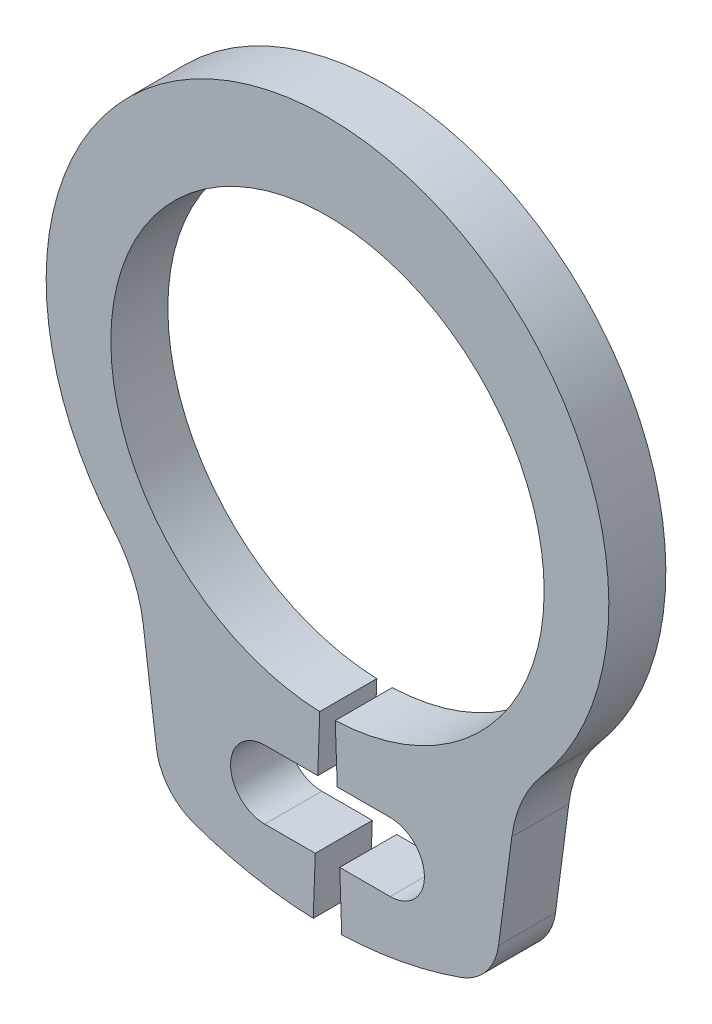
ISO-10303-21;
HEADER;
FILE_DESCRIPTION(('STEP AP214'),'2;1');
FILE_NAME('part.step','',(''),(''),'','','');
FILE_SCHEMA(('AUTOMOTIVE_DESIGN { 1 0 10303 214 1 1 1 1 }'));
ENDSEC;
DATA;
#1=APPLICATION_CONTEXT('core data for automotive mechanical design processes');
#2=APPLICATION_PROTOCOL_DEFINITION('international standard','automotive_design',2000,#1);
#3=PRODUCT_CONTEXT('',#1,'mechanical');
#4=PRODUCT('Part','Part','',(#3));
#5=PRODUCT_RELATED_PRODUCT_CATEGORY('part','',(#4));
#6=PRODUCT_DEFINITION_FORMATION('','',#4);
#7=PRODUCT_DEFINITION_CONTEXT('part definition',#1,'design');
#8=PRODUCT_DEFINITION('design','',#6,#7);
#9=PRODUCT_DEFINITION_SHAPE('','',#8);
#10=(LENGTH_UNIT() NAMED_UNIT(*) SI_UNIT(.MILLI.,.METRE.));
#11=(NAMED_UNIT(*) PLANE_ANGLE_UNIT() SI_UNIT($,.RADIAN.));
#12=(NAMED_UNIT(*) SI_UNIT($,.STERADIAN.) SOLID_ANGLE_UNIT());
#13=UNCERTAINTY_MEASURE_WITH_UNIT(LENGTH_MEASURE(1.E-05),#10,'distance_accuracy_value','');
#14=(GEOMETRIC_REPRESENTATION_CONTEXT(3) GLOBAL_UNCERTAINTY_ASSIGNED_CONTEXT((#13)) GLOBAL_UNIT_ASSIGNED_CONTEXT((#10,
#11,#12)) REPRESENTATION_CONTEXT('',''));
#15=CARTESIAN_POINT('',(0.,0.,0.));
#16=DIRECTION('',(0.,0.,1.));
#17=DIRECTION('',(1.,0.,0.));
#18=AXIS2_PLACEMENT_3D('',#15,#16,#17);
#19=CARTESIAN_POINT('',(-0.135714285714286,-3.79757575732902,-1.));
#20=DIRECTION('',(0.999362041402373,-0.0357142857142857,0.));
#21=DIRECTION('',(0.0357142857142857,0.999362041402373,0.));
#22=AXIS2_PLACEMENT_3D('',#19,#20,#21);
#23=PLANE('',#22);
#24=DIRECTION('',(0.,0.,1.));
#25=VECTOR('',#24,1.);
#26=CARTESIAN_POINT('',(-0.171140517497504,-4.78887743412299,-1.));
#27=LINE('',#26,#25);
#28=CARTESIAN_POINT('',(-0.171140517497504,-4.78887743412299,-1.));
#29=VERTEX_POINT('',#28);
#30=CARTESIAN_POINT('',(-0.171140517497504,-4.78887743412299,0.));
#31=VERTEX_POINT('',#30);
#32=EDGE_CURVE('E199',#29,#31,#27,.T.);
#33=ORIENTED_EDGE('',*,*,#32,.F.);
#34=DIRECTION('',(0.0357142857142857,0.999362041402373,0.));
#35=VECTOR('',#34,1.);
#36=CARTESIAN_POINT('',(-0.135714285714286,-3.79757575732902,-1.));
#37=LINE('',#36,#35);
#38=CARTESIAN_POINT('',(-0.135714285714286,-3.79757575732902,-1.));
#39=VERTEX_POINT('',#38);
#40=EDGE_CURVE('E281',#29,#39,#37,.T.);
#41=ORIENTED_EDGE('',*,*,#40,.T.);
#42=DIRECTION('',(0.,0.,1.));
#43=VECTOR('',#42,1.);
#44=CARTESIAN_POINT('',(-0.135714285714286,-3.79757575732902,-1.));
#45=LINE('',#44,#43);
#46=CARTESIAN_POINT('',(-0.135714285714286,-3.79757575732902,0.));
#47=VERTEX_POINT('',#46);
#48=EDGE_CURVE('E11',#39,#47,#45,.T.);
#49=ORIENTED_EDGE('',*,*,#48,.T.);
#50=DIRECTION('',(0.0357142857142857,0.999362041402373,0.));
#51=VECTOR('',#50,1.);
#52=CARTESIAN_POINT('',(-0.135714285714286,-3.79757575732902,0.));
#53=LINE('',#52,#51);
#54=EDGE_CURVE('E245',#31,#47,#53,.T.);
#55=ORIENTED_EDGE('',*,*,#54,.F.);
#56=EDGE_LOOP('',(#33,#41,#49,#55));
#57=FACE_BOUND('',#56,.T.);
#58=ADVANCED_FACE('F32',(#57),#23,.T.);
#59=CARTESIAN_POINT('',(0.135714285714286,-3.79757575732902,-1.));
#60=DIRECTION('',(-0.999362041402373,-0.0357142857142857,0.));
#61=DIRECTION('',(0.0357142857142857,-0.999362041402373,0.));
#62=AXIS2_PLACEMENT_3D('',#59,#60,#61);
#63=PLANE('',#62);
#64=DIRECTION('',(0.,0.,-1.));
#65=VECTOR('',#64,1.);
#66=CARTESIAN_POINT('',(0.171140517497504,-4.78887743412299,-1.));
#67=LINE('',#66,#65);
#68=CARTESIAN_POINT('',(0.171140517497504,-4.78887743412299,0.));
#69=VERTEX_POINT('',#68);
#70=CARTESIAN_POINT('',(0.171140517497504,-4.78887743412299,-1.));
#71=VERTEX_POINT('',#70);
#72=EDGE_CURVE('E203',#69,#71,#67,.T.);
#73=ORIENTED_EDGE('',*,*,#72,.F.);
#74=DIRECTION('',(0.0357142857142857,-0.999362041402373,0.));
#75=VECTOR('',#74,1.);
#76=CARTESIAN_POINT('',(0.135714285714286,-3.79757575732902,0.));
#77=LINE('',#76,#75);
#78=CARTESIAN_POINT('',(0.135714285714286,-3.79757575732902,0.));
#79=VERTEX_POINT('',#78);
#80=EDGE_CURVE('E216',#79,#69,#77,.T.);
#81=ORIENTED_EDGE('',*,*,#80,.F.);
#82=DIRECTION('',(0.,0.,1.));
#83=VECTOR('',#82,1.);
#84=CARTESIAN_POINT('',(0.135714285714286,-3.79757575732902,-1.));
#85=LINE('',#84,#83);
#86=CARTESIAN_POINT('',(0.135714285714286,-3.79757575732902,-1.));
#87=VERTEX_POINT('',#86);
#88=EDGE_CURVE('E36',#87,#79,#85,.T.);
#89=ORIENTED_EDGE('',*,*,#88,.F.);
#90=DIRECTION('',(0.0357142857142857,-0.999362041402373,0.));
#91=VECTOR('',#90,1.);
#92=CARTESIAN_POINT('',(0.135714285714286,-3.79757575732902,-1.));
#93=LINE('',#92,#91);
#94=EDGE_CURVE('E251',#87,#71,#93,.T.);
#95=ORIENTED_EDGE('',*,*,#94,.T.);
#96=EDGE_LOOP('',(#73,#81,#89,#95));
#97=FACE_BOUND('',#96,.T.);
#98=ADVANCED_FACE('F315',(#97),#63,.T.);
#99=CARTESIAN_POINT('',(0.,0.,-1.));
#100=DIRECTION('',(0.,0.,1.));
#101=DIRECTION('',(1.,0.,0.));
#102=AXIS2_PLACEMENT_3D('',#99,#100,#101);
#103=CYLINDRICAL_SURFACE('',#102,3.8);
#104=CARTESIAN_POINT('',(0.,0.,0.));
#105=DIRECTION('',(0.,0.,-1.));
#106=DIRECTION('',(1.,0.,0.));
#107=AXIS2_PLACEMENT_3D('',#104,#105,#106);
#108=CIRCLE('',#107,3.8);
#109=EDGE_CURVE('E212',#47,#79,#108,.T.);
#110=ORIENTED_EDGE('',*,*,#109,.F.);
#111=ORIENTED_EDGE('',*,*,#48,.F.);
#112=CARTESIAN_POINT('',(0.,0.,-1.));
#113=DIRECTION('',(0.,0.,-1.));
#114=DIRECTION('',(1.,0.,0.));
#115=AXIS2_PLACEMENT_3D('',#112,#113,#114);
#116=CIRCLE('',#115,3.8);
#117=EDGE_CURVE('E247',#39,#87,#116,.T.);
#118=ORIENTED_EDGE('',*,*,#117,.T.);
#119=ORIENTED_EDGE('',*,*,#88,.T.);
#120=EDGE_LOOP('',(#110,#111,#118,#119));
#121=FACE_BOUND('',#120,.T.);
#122=ADVANCED_FACE('F34',(#121),#103,.F.);
#123=DIRECTION('',(0.,0.,-1.));
#124=VECTOR('',#123,1.);
#125=CARTESIAN_POINT('',(-0.214025018891016,-5.98887743412299,-1.));
#126=LINE('',#125,#124);
#127=CARTESIAN_POINT('',(-0.214025018891016,-5.98887743412299,0.));
#128=VERTEX_POINT('',#127);
#129=CARTESIAN_POINT('',(-0.214025018891016,-5.98887743412299,-1.));
#130=VERTEX_POINT('',#129);
#131=EDGE_CURVE('E337',#128,#130,#126,.T.);
#132=ORIENTED_EDGE('',*,*,#131,.F.);
#133=CARTESIAN_POINT('',(-0.25,-6.99553428981661,0.));
#134=VERTEX_POINT('',#133);
#135=EDGE_CURVE('E193',#134,#128,#53,.T.);
#136=ORIENTED_EDGE('',*,*,#135,.F.);
#137=DIRECTION('',(0.,0.,1.));
#138=VECTOR('',#137,1.);
#139=CARTESIAN_POINT('',(-0.25,-6.99553428981661,-1.));
#140=LINE('',#139,#138);
#141=CARTESIAN_POINT('',(-0.25,-6.99553428981661,-1.));
#142=VERTEX_POINT('',#141);
#143=EDGE_CURVE('E41',#142,#134,#140,.T.);
#144=ORIENTED_EDGE('',*,*,#143,.F.);
#145=EDGE_CURVE('E282',#142,#130,#37,.T.);
#146=ORIENTED_EDGE('',*,*,#145,.T.);
#147=EDGE_LOOP('',(#132,#136,#144,#146));
#148=FACE_BOUND('',#147,.T.);
#149=ADVANCED_FACE('F346',(#148),#23,.T.);
#150=CARTESIAN_POINT('',(0.,0.,-1.));
#151=DIRECTION('',(0.,0.,1.));
#152=DIRECTION('',(1.,0.,0.));
#153=AXIS2_PLACEMENT_3D('',#150,#151,#152);
#154=CYLINDRICAL_SURFACE('',#153,7.);
#155=CARTESIAN_POINT('',(0.,0.,0.));
#156=DIRECTION('',(0.,0.,1.));
#157=DIRECTION('',(1.,0.,0.));
#158=AXIS2_PLACEMENT_3D('',#155,#156,#157);
#159=CIRCLE('',#158,7.);
#160=CARTESIAN_POINT('',(-2.34274629481053,-6.59632775096504,0.));
#161=VERTEX_POINT('',#160);
#162=EDGE_CURVE('E243',#161,#134,#159,.T.);
#163=ORIENTED_EDGE('',*,*,#162,.F.);
#164=DIRECTION('',(0.,0.,1.));
#165=VECTOR('',#164,1.);
#166=CARTESIAN_POINT('',(-2.34274629481053,-6.59632775096504,-1.));
#167=LINE('',#166,#165);
#168=CARTESIAN_POINT('',(-2.34274629481053,-6.59632775096504,-1.));
#169=VERTEX_POINT('',#168);
#170=EDGE_CURVE('E286',#169,#161,#167,.T.);
#171=ORIENTED_EDGE('',*,*,#170,.F.);
#172=CARTESIAN_POINT('',(0.,0.,-1.));
#173=DIRECTION('',(0.,0.,1.));
#174=DIRECTION('',(1.,0.,0.));
#175=AXIS2_PLACEMENT_3D('',#172,#173,#174);
#176=CIRCLE('',#175,7.);
#177=EDGE_CURVE('E278',#169,#142,#176,.T.);
#178=ORIENTED_EDGE('',*,*,#177,.T.);
#179=ORIENTED_EDGE('',*,*,#143,.T.);
#180=EDGE_LOOP('',(#163,#171,#178,#179));
#181=FACE_BOUND('',#180,.T.);
#182=ADVANCED_FACE('F349',(#181),#154,.T.);
#183=CARTESIAN_POINT('',(-2.00806825269474,-5.65399521511289,-1.));
#184=DIRECTION('',(0.,0.,1.));
#185=DIRECTION('',(1.,0.,0.));
#186=AXIS2_PLACEMENT_3D('',#183,#184,#185);
#187=CYLINDRICAL_SURFACE('',#186,1.);
#188=CARTESIAN_POINT('',(-2.00806825269474,-5.65399521511289,0.));
#189=DIRECTION('',(0.,0.,1.));
#190=DIRECTION('',(1.,0.,0.));
#191=AXIS2_PLACEMENT_3D('',#188,#189,#190);
#192=CIRCLE('',#191,1.);
#193=CARTESIAN_POINT('',(-2.99951311406855,-5.78452140733294,0.));
#194=VERTEX_POINT('',#193);
#195=EDGE_CURVE('E240',#194,#161,#192,.T.);
#196=ORIENTED_EDGE('',*,*,#195,.F.);
#197=DIRECTION('',(0.,0.,1.));
#198=VECTOR('',#197,1.);
#199=CARTESIAN_POINT('',(-2.99951311406855,-5.78452140733294,-1.));
#200=LINE('',#199,#198);
#201=CARTESIAN_POINT('',(-2.99951311406855,-5.78452140733294,-1.));
#202=VERTEX_POINT('',#201);
#203=EDGE_CURVE('E288',#202,#194,#200,.T.);
#204=ORIENTED_EDGE('',*,*,#203,.F.);
#205=CARTESIAN_POINT('',(-2.00806825269474,-5.65399521511289,-1.));
#206=DIRECTION('',(0.,0.,1.));
#207=DIRECTION('',(1.,0.,0.));
#208=AXIS2_PLACEMENT_3D('',#205,#206,#207);
#209=CIRCLE('',#208,1.);
#210=EDGE_CURVE('E275',#202,#169,#209,.T.);
#211=ORIENTED_EDGE('',*,*,#210,.T.);
#212=ORIENTED_EDGE('',*,*,#170,.T.);
#213=EDGE_LOOP('',(#196,#204,#211,#212));
#214=FACE_BOUND('',#213,.T.);
#215=ADVANCED_FACE('F354',(#214),#187,.T.);
#216=CARTESIAN_POINT('',(-3.232103528292,-4.01782181191477,-1.));
#217=DIRECTION('',(-0.99144486137381,-0.130526192220053,0.));
#218=DIRECTION('',(0.130526192220053,-0.99144486137381,0.));
#219=AXIS2_PLACEMENT_3D('',#216,#217,#218);
#220=PLANE('',#219);
#221=DIRECTION('',(0.130526192220053,-0.99144486137381,0.));
#222=VECTOR('',#221,1.);
#223=CARTESIAN_POINT('',(-3.232103528292,-4.01782181191477,0.));
#224=LINE('',#223,#222);
#225=CARTESIAN_POINT('',(-3.232103528292,-4.01782181191477,0.));
#226=VERTEX_POINT('',#225);
#227=EDGE_CURVE('E237',#226,#194,#224,.T.);
#228=ORIENTED_EDGE('',*,*,#227,.F.);
#229=DIRECTION('',(0.,0.,1.));
#230=VECTOR('',#229,1.);
#231=CARTESIAN_POINT('',(-3.232103528292,-4.01782181191477,-1.));
#232=LINE('',#231,#230);
#233=CARTESIAN_POINT('',(-3.232103528292,-4.01782181191477,-1.));
#234=VERTEX_POINT('',#233);
#235=EDGE_CURVE('E290',#234,#226,#232,.T.);
#236=ORIENTED_EDGE('',*,*,#235,.F.);
#237=DIRECTION('',(0.130526192220053,-0.99144486137381,0.));
#238=VECTOR('',#237,1.);
#239=CARTESIAN_POINT('',(-3.232103528292,-4.01782181191477,-1.));
#240=LINE('',#239,#238);
#241=EDGE_CURVE('E272',#234,#202,#240,.T.);
#242=ORIENTED_EDGE('',*,*,#241,.T.);
#243=ORIENTED_EDGE('',*,*,#203,.T.);
#244=EDGE_LOOP('',(#228,#236,#242,#243));
#245=FACE_BOUND('',#244,.T.);
#246=ADVANCED_FACE('F357',(#245),#220,.T.);
#247=CARTESIAN_POINT('',(-5.50977445658009,-4.3176828783061,-1.));
#248=DIRECTION('',(0.,0.,1.));
#249=DIRECTION('',(1.,0.,0.));
#250=AXIS2_PLACEMENT_3D('',#247,#248,#249);
#251=CYLINDRICAL_SURFACE('',#250,2.29732486094285);
#252=CARTESIAN_POINT('',(-5.50977445658009,-4.3176828783061,0.));
#253=DIRECTION('',(0.,0.,-1.));
#254=DIRECTION('',(1.,0.,0.));
#255=AXIS2_PLACEMENT_3D('',#252,#253,#254);
#256=CIRCLE('',#255,2.29732486094285);
#257=CARTESIAN_POINT('',(-3.75939498804083,-2.82977386468252,0.));
#258=VERTEX_POINT('',#257);
#259=EDGE_CURVE('E234',#258,#226,#256,.T.);
#260=ORIENTED_EDGE('',*,*,#259,.F.);
#261=DIRECTION('',(0.,0.,1.));
#262=VECTOR('',#261,1.);
#263=CARTESIAN_POINT('',(-3.75939498804083,-2.82977386468252,-1.));
#264=LINE('',#263,#262);
#265=CARTESIAN_POINT('',(-3.75939498804083,-2.82977386468252,-1.));
#266=VERTEX_POINT('',#265);
#267=EDGE_CURVE('E292',#266,#258,#264,.T.);
#268=ORIENTED_EDGE('',*,*,#267,.F.);
#269=CARTESIAN_POINT('',(-5.50977445658009,-4.3176828783061,-1.));
#270=DIRECTION('',(0.,0.,-1.));
#271=DIRECTION('',(1.,0.,0.));
#272=AXIS2_PLACEMENT_3D('',#269,#270,#271);
#273=CIRCLE('',#272,2.29732486094285);
#274=EDGE_CURVE('E269',#266,#234,#273,.T.);
#275=ORIENTED_EDGE('',*,*,#274,.T.);
#276=ORIENTED_EDGE('',*,*,#235,.T.);
#277=EDGE_LOOP('',(#260,#268,#275,#276));
#278=FACE_BOUND('',#277,.T.);
#279=ADVANCED_FACE('F362',(#278),#251,.F.);
#280=CARTESIAN_POINT('',(0.,0.365897582003999,-1.));
#281=DIRECTION('',(0.,0.,1.));
#282=DIRECTION('',(1.,0.,0.));
#283=AXIS2_PLACEMENT_3D('',#280,#281,#282);
#284=CYLINDRICAL_SURFACE('',#283,4.934102417996);
#285=CARTESIAN_POINT('',(0.,0.365897582003999,0.));
#286=DIRECTION('',(0.,0.,1.));
#287=DIRECTION('',(1.,0.,0.));
#288=AXIS2_PLACEMENT_3D('',#285,#286,#287);
#289=CIRCLE('',#288,4.934102417996);
#290=CARTESIAN_POINT('',(3.75939498804082,-2.82977386468252,0.));
#291=VERTEX_POINT('',#290);
#292=EDGE_CURVE('E231',#291,#258,#289,.T.);
#293=ORIENTED_EDGE('',*,*,#292,.F.);
#294=DIRECTION('',(0.,0.,1.));
#295=VECTOR('',#294,1.);
#296=CARTESIAN_POINT('',(3.75939498804082,-2.82977386468252,-1.));
#297=LINE('',#296,#295);
#298=CARTESIAN_POINT('',(3.75939498804082,-2.82977386468252,-1.));
#299=VERTEX_POINT('',#298);
#300=EDGE_CURVE('E294',#299,#291,#297,.T.);
#301=ORIENTED_EDGE('',*,*,#300,.F.);
#302=CARTESIAN_POINT('',(0.,0.365897582003999,-1.));
#303=DIRECTION('',(0.,0.,1.));
#304=DIRECTION('',(1.,0.,0.));
#305=AXIS2_PLACEMENT_3D('',#302,#303,#304);
#306=CIRCLE('',#305,4.934102417996);
#307=EDGE_CURVE('E266',#299,#266,#306,.T.);
#308=ORIENTED_EDGE('',*,*,#307,.T.);
#309=ORIENTED_EDGE('',*,*,#267,.T.);
#310=EDGE_LOOP('',(#293,#301,#308,#309));
#311=FACE_BOUND('',#310,.T.);
#312=ADVANCED_FACE('F365',(#311),#284,.T.);
#313=CARTESIAN_POINT('',(5.50977445658009,-4.3176828783061,-1.));
#314=DIRECTION('',(0.,0.,1.));
#315=DIRECTION('',(1.,0.,0.));
#316=AXIS2_PLACEMENT_3D('',#313,#314,#315);
#317=CYLINDRICAL_SURFACE('',#316,2.29732486094285);
#318=CARTESIAN_POINT('',(5.50977445658009,-4.3176828783061,0.));
#319=DIRECTION('',(0.,0.,-1.));
#320=DIRECTION('',(1.,0.,0.));
#321=AXIS2_PLACEMENT_3D('',#318,#319,#320);
#322=CIRCLE('',#321,2.29732486094285);
#323=CARTESIAN_POINT('',(3.232103528292,-4.01782181191477,0.));
#324=VERTEX_POINT('',#323);
#325=EDGE_CURVE('E228',#324,#291,#322,.T.);
#326=ORIENTED_EDGE('',*,*,#325,.F.);
#327=DIRECTION('',(0.,0.,1.));
#328=VECTOR('',#327,1.);
#329=CARTESIAN_POINT('',(3.232103528292,-4.01782181191477,-1.));
#330=LINE('',#329,#328);
#331=CARTESIAN_POINT('',(3.232103528292,-4.01782181191477,-1.));
#332=VERTEX_POINT('',#331);
#333=EDGE_CURVE('E296',#332,#324,#330,.T.);
#334=ORIENTED_EDGE('',*,*,#333,.F.);
#335=CARTESIAN_POINT('',(5.50977445658009,-4.3176828783061,-1.));
#336=DIRECTION('',(0.,0.,-1.));
#337=DIRECTION('',(1.,0.,0.));
#338=AXIS2_PLACEMENT_3D('',#335,#336,#337);
#339=CIRCLE('',#338,2.29732486094285);
#340=EDGE_CURVE('E263',#332,#299,#339,.T.);
#341=ORIENTED_EDGE('',*,*,#340,.T.);
#342=ORIENTED_EDGE('',*,*,#300,.T.);
#343=EDGE_LOOP('',(#326,#334,#341,#342));
#344=FACE_BOUND('',#343,.T.);
#345=ADVANCED_FACE('F370',(#344),#317,.F.);
#346=CARTESIAN_POINT('',(3.232103528292,-4.01782181191477,-1.));
#347=DIRECTION('',(0.99144486137381,-0.130526192220053,0.));
#348=DIRECTION('',(0.130526192220053,0.99144486137381,0.));
#349=AXIS2_PLACEMENT_3D('',#346,#347,#348);
#350=PLANE('',#349);
#351=DIRECTION('',(0.130526192220053,0.99144486137381,0.));
#352=VECTOR('',#351,1.);
#353=CARTESIAN_POINT('',(3.232103528292,-4.01782181191477,0.));
#354=LINE('',#353,#352);
#355=CARTESIAN_POINT('',(2.99951311406855,-5.78452140733294,0.));
#356=VERTEX_POINT('',#355);
#357=EDGE_CURVE('E225',#356,#324,#354,.T.);
#358=ORIENTED_EDGE('',*,*,#357,.F.);
#359=DIRECTION('',(0.,0.,1.));
#360=VECTOR('',#359,1.);
#361=CARTESIAN_POINT('',(2.99951311406855,-5.78452140733294,-1.));
#362=LINE('',#361,#360);
#363=CARTESIAN_POINT('',(2.99951311406855,-5.78452140733294,-1.));
#364=VERTEX_POINT('',#363);
#365=EDGE_CURVE('E298',#364,#356,#362,.T.);
#366=ORIENTED_EDGE('',*,*,#365,.F.);
#367=DIRECTION('',(0.130526192220053,0.99144486137381,0.));
#368=VECTOR('',#367,1.);
#369=CARTESIAN_POINT('',(3.232103528292,-4.01782181191477,-1.));
#370=LINE('',#369,#368);
#371=EDGE_CURVE('E260',#364,#332,#370,.T.);
#372=ORIENTED_EDGE('',*,*,#371,.T.);
#373=ORIENTED_EDGE('',*,*,#333,.T.);
#374=EDGE_LOOP('',(#358,#366,#372,#373));
#375=FACE_BOUND('',#374,.T.);
#376=ADVANCED_FACE('F373',(#375),#350,.T.);
#377=CARTESIAN_POINT('',(2.00806825269474,-5.65399521511289,-1.));
#378=DIRECTION('',(0.,0.,1.));
#379=DIRECTION('',(1.,0.,0.));
#380=AXIS2_PLACEMENT_3D('',#377,#378,#379);
#381=CYLINDRICAL_SURFACE('',#380,1.);
#382=CARTESIAN_POINT('',(2.00806825269474,-5.65399521511289,0.));
#383=DIRECTION('',(0.,0.,1.));
#384=DIRECTION('',(-1.,0.,0.));
#385=AXIS2_PLACEMENT_3D('',#382,#383,#384);
#386=CIRCLE('',#385,1.);
#387=CARTESIAN_POINT('',(2.34274629481053,-6.59632775096504,0.));
#388=VERTEX_POINT('',#387);
#389=EDGE_CURVE('E222',#388,#356,#386,.T.);
#390=ORIENTED_EDGE('',*,*,#389,.F.);
#391=DIRECTION('',(0.,0.,1.));
#392=VECTOR('',#391,1.);
#393=CARTESIAN_POINT('',(2.34274629481053,-6.59632775096504,-1.));
#394=LINE('',#393,#392);
#395=CARTESIAN_POINT('',(2.34274629481053,-6.59632775096504,-1.));
#396=VERTEX_POINT('',#395);
#397=EDGE_CURVE('E300',#396,#388,#394,.T.);
#398=ORIENTED_EDGE('',*,*,#397,.F.);
#399=CARTESIAN_POINT('',(2.00806825269474,-5.65399521511289,-1.));
#400=DIRECTION('',(0.,0.,1.));
#401=DIRECTION('',(-1.,0.,0.));
#402=AXIS2_PLACEMENT_3D('',#399,#400,#401);
#403=CIRCLE('',#402,1.);
#404=EDGE_CURVE('E257',#396,#364,#403,.T.);
#405=ORIENTED_EDGE('',*,*,#404,.T.);
#406=ORIENTED_EDGE('',*,*,#365,.T.);
#407=EDGE_LOOP('',(#390,#398,#405,#406));
#408=FACE_BOUND('',#407,.T.);
#409=ADVANCED_FACE('F378',(#408),#381,.T.);
#410=CARTESIAN_POINT('',(0.,0.,-1.));
#411=DIRECTION('',(0.,0.,1.));
#412=DIRECTION('',(1.,0.,0.));
#413=AXIS2_PLACEMENT_3D('',#410,#411,#412);
#414=CYLINDRICAL_SURFACE('',#413,7.);
#415=CARTESIAN_POINT('',(0.,0.,0.));
#416=DIRECTION('',(0.,0.,1.));
#417=DIRECTION('',(1.,0.,0.));
#418=AXIS2_PLACEMENT_3D('',#415,#416,#417);
#419=CIRCLE('',#418,7.);
#420=CARTESIAN_POINT('',(0.249999999999998,-6.99553428981661,0.));
#421=VERTEX_POINT('',#420);
#422=EDGE_CURVE('E219',#421,#388,#419,.T.);
#423=ORIENTED_EDGE('',*,*,#422,.F.);
#424=DIRECTION('',(0.,0.,1.));
#425=VECTOR('',#424,1.);
#426=CARTESIAN_POINT('',(0.249999999999998,-6.99553428981661,-1.));
#427=LINE('',#426,#425);
#428=CARTESIAN_POINT('',(0.249999999999998,-6.99553428981661,-1.));
#429=VERTEX_POINT('',#428);
#430=EDGE_CURVE('E301',#429,#421,#427,.T.);
#431=ORIENTED_EDGE('',*,*,#430,.F.);
#432=CARTESIAN_POINT('',(0.,0.,-1.));
#433=DIRECTION('',(0.,0.,1.));
#434=DIRECTION('',(1.,0.,0.));
#435=AXIS2_PLACEMENT_3D('',#432,#433,#434);
#436=CIRCLE('',#435,7.);
#437=EDGE_CURVE('E254',#429,#396,#436,.T.);
#438=ORIENTED_EDGE('',*,*,#437,.T.);
#439=ORIENTED_EDGE('',*,*,#397,.T.);
#440=EDGE_LOOP('',(#423,#431,#438,#439));
#441=FACE_BOUND('',#440,.T.);
#442=ADVANCED_FACE('F380',(#441),#414,.T.);
#443=DIRECTION('',(0.,0.,1.));
#444=VECTOR('',#443,1.);
#445=CARTESIAN_POINT('',(0.214025018891016,-5.98887743412299,-1.));
#446=LINE('',#445,#444);
#447=CARTESIAN_POINT('',(0.214025018891016,-5.98887743412299,-1.));
#448=VERTEX_POINT('',#447);
#449=CARTESIAN_POINT('',(0.214025018891016,-5.98887743412299,0.));
#450=VERTEX_POINT('',#449);
#451=EDGE_CURVE('E333',#448,#450,#446,.T.);
#452=ORIENTED_EDGE('',*,*,#451,.F.);
#453=EDGE_CURVE('E250',#448,#429,#93,.T.);
#454=ORIENTED_EDGE('',*,*,#453,.T.);
#455=ORIENTED_EDGE('',*,*,#430,.T.);
#456=EDGE_CURVE('E215',#450,#421,#77,.T.);
#457=ORIENTED_EDGE('',*,*,#456,.F.);
#458=EDGE_LOOP('',(#452,#454,#455,#457));
#459=FACE_BOUND('',#458,.T.);
#460=ADVANCED_FACE('F383',(#459),#63,.T.);
#461=CARTESIAN_POINT('',(0.,0.,-1.));
#462=DIRECTION('',(0.,0.,1.));
#463=DIRECTION('',(1.,0.,0.));
#464=AXIS2_PLACEMENT_3D('',#461,#462,#463);
#465=PLANE('',#464);
#466=CARTESIAN_POINT('',(1.1,-5.38887743412299,-1.));
#467=DIRECTION('',(0.,0.,1.));
#468=DIRECTION('',(1.,0.,0.));
#469=AXIS2_PLACEMENT_3D('',#466,#467,#468);
#470=CIRCLE('',#469,0.6);
#471=CARTESIAN_POINT('',(1.1,-5.98887743412299,-1.));
#472=VERTEX_POINT('',#471);
#473=CARTESIAN_POINT('',(1.1,-4.78887743412299,-1.));
#474=VERTEX_POINT('',#473);
#475=EDGE_CURVE('E209',#472,#474,#470,.T.);
#476=ORIENTED_EDGE('',*,*,#475,.T.);
#477=DIRECTION('',(-1.,0.,0.));
#478=VECTOR('',#477,1.);
#479=CARTESIAN_POINT('',(-1.1,-4.78887743412299,-1.));
#480=LINE('',#479,#478);
#481=EDGE_CURVE('E57',#474,#71,#480,.T.);
#482=ORIENTED_EDGE('',*,*,#481,.T.);
#483=ORIENTED_EDGE('',*,*,#94,.F.);
#484=ORIENTED_EDGE('',*,*,#117,.F.);
#485=ORIENTED_EDGE('',*,*,#40,.F.);
#486=CARTESIAN_POINT('',(-1.1,-4.78887743412299,-1.));
#487=VERTEX_POINT('',#486);
#488=EDGE_CURVE('E194',#29,#487,#480,.T.);
#489=ORIENTED_EDGE('',*,*,#488,.T.);
#490=CARTESIAN_POINT('',(-1.1,-5.38887743412299,-1.));
#491=DIRECTION('',(0.,0.,1.));
#492=DIRECTION('',(1.,0.,0.));
#493=AXIS2_PLACEMENT_3D('',#490,#491,#492);
#494=CIRCLE('',#493,0.6);
#495=CARTESIAN_POINT('',(-1.1,-5.98887743412299,-1.));
#496=VERTEX_POINT('',#495);
#497=EDGE_CURVE('E198',#487,#496,#494,.T.);
#498=ORIENTED_EDGE('',*,*,#497,.T.);
#499=DIRECTION('',(1.,0.,0.));
#500=VECTOR('',#499,1.);
#501=CARTESIAN_POINT('',(1.1,-5.98887743412299,-1.));
#502=LINE('',#501,#500);
#503=EDGE_CURVE('E176',#496,#130,#502,.T.);
#504=ORIENTED_EDGE('',*,*,#503,.T.);
#505=ORIENTED_EDGE('',*,*,#145,.F.);
#506=ORIENTED_EDGE('',*,*,#177,.F.);
#507=ORIENTED_EDGE('',*,*,#210,.F.);
#508=ORIENTED_EDGE('',*,*,#241,.F.);
#509=ORIENTED_EDGE('',*,*,#274,.F.);
#510=ORIENTED_EDGE('',*,*,#307,.F.);
#511=ORIENTED_EDGE('',*,*,#340,.F.);
#512=ORIENTED_EDGE('',*,*,#371,.F.);
#513=ORIENTED_EDGE('',*,*,#404,.F.);
#514=ORIENTED_EDGE('',*,*,#437,.F.);
#515=ORIENTED_EDGE('',*,*,#453,.F.);
#516=EDGE_CURVE('E326',#448,#472,#502,.T.);
#517=ORIENTED_EDGE('',*,*,#516,.T.);
#518=EDGE_LOOP('',(#476,#482,#483,#484,#485,#489,#498,#504,#505,#506,#507,#508,#509,#510,#511,
#512,#513,#514,#515,#517));
#519=FACE_BOUND('',#518,.T.);
#520=ADVANCED_FACE('F322',(#519),#465,.F.);
#521=CARTESIAN_POINT('',(0.,0.,0.));
#522=DIRECTION('',(0.,0.,1.));
#523=DIRECTION('',(1.,0.,0.));
#524=AXIS2_PLACEMENT_3D('',#521,#522,#523);
#525=PLANE('',#524);
#526=DIRECTION('',(-1.,0.,0.));
#527=VECTOR('',#526,1.);
#528=CARTESIAN_POINT('',(-1.1,-4.78887743412299,0.));
#529=LINE('',#528,#527);
#530=CARTESIAN_POINT('',(1.1,-4.78887743412299,0.));
#531=VERTEX_POINT('',#530);
#532=EDGE_CURVE('E339',#531,#69,#529,.T.);
#533=ORIENTED_EDGE('',*,*,#532,.F.);
#534=CARTESIAN_POINT('',(1.1,-5.38887743412299,0.));
#535=DIRECTION('',(0.,0.,1.));
#536=DIRECTION('',(1.,0.,0.));
#537=AXIS2_PLACEMENT_3D('',#534,#535,#536);
#538=CIRCLE('',#537,0.6);
#539=CARTESIAN_POINT('',(1.1,-5.98887743412299,0.));
#540=VERTEX_POINT('',#539);
#541=EDGE_CURVE('E201',#540,#531,#538,.T.);
#542=ORIENTED_EDGE('',*,*,#541,.F.);
#543=DIRECTION('',(1.,0.,0.));
#544=VECTOR('',#543,1.);
#545=CARTESIAN_POINT('',(1.1,-5.98887743412299,0.));
#546=LINE('',#545,#544);
#547=EDGE_CURVE('E49',#450,#540,#546,.T.);
#548=ORIENTED_EDGE('',*,*,#547,.F.);
#549=ORIENTED_EDGE('',*,*,#456,.T.);
#550=ORIENTED_EDGE('',*,*,#422,.T.);
#551=ORIENTED_EDGE('',*,*,#389,.T.);
#552=ORIENTED_EDGE('',*,*,#357,.T.);
#553=ORIENTED_EDGE('',*,*,#325,.T.);
#554=ORIENTED_EDGE('',*,*,#292,.T.);
#555=ORIENTED_EDGE('',*,*,#259,.T.);
#556=ORIENTED_EDGE('',*,*,#227,.T.);
#557=ORIENTED_EDGE('',*,*,#195,.T.);
#558=ORIENTED_EDGE('',*,*,#162,.T.);
#559=ORIENTED_EDGE('',*,*,#135,.T.);
#560=CARTESIAN_POINT('',(-1.1,-5.98887743412299,0.));
#561=VERTEX_POINT('',#560);
#562=EDGE_CURVE('E173',#561,#128,#546,.T.);
#563=ORIENTED_EDGE('',*,*,#562,.F.);
#564=CARTESIAN_POINT('',(-1.1,-5.38887743412299,0.));
#565=DIRECTION('',(0.,0.,1.));
#566=DIRECTION('',(1.,0.,0.));
#567=AXIS2_PLACEMENT_3D('',#564,#565,#566);
#568=CIRCLE('',#567,0.6);
#569=CARTESIAN_POINT('',(-1.1,-4.78887743412299,0.));
#570=VERTEX_POINT('',#569);
#571=EDGE_CURVE('E190',#570,#561,#568,.T.);
#572=ORIENTED_EDGE('',*,*,#571,.F.);
#573=EDGE_CURVE('E317',#31,#570,#529,.T.);
#574=ORIENTED_EDGE('',*,*,#573,.F.);
#575=ORIENTED_EDGE('',*,*,#54,.T.);
#576=ORIENTED_EDGE('',*,*,#109,.T.);
#577=ORIENTED_EDGE('',*,*,#80,.T.);
#578=EDGE_LOOP('',(#533,#542,#548,#549,#550,#551,#552,#553,#554,#555,#556,#557,#558,#559,#563,
#572,#574,#575,#576,#577));
#579=FACE_BOUND('',#578,.T.);
#580=ADVANCED_FACE('F188',(#579),#525,.T.);
#581=CARTESIAN_POINT('',(1.1,-5.38887743412299,-1.));
#582=DIRECTION('',(0.,0.,1.));
#583=DIRECTION('',(1.,0.,0.));
#584=AXIS2_PLACEMENT_3D('',#581,#582,#583);
#585=CYLINDRICAL_SURFACE('',#584,0.6);
#586=ORIENTED_EDGE('',*,*,#541,.T.);
#587=DIRECTION('',(0.,0.,1.));
#588=VECTOR('',#587,1.);
#589=CARTESIAN_POINT('',(1.1,-4.78887743412299,-1.));
#590=LINE('',#589,#588);
#591=EDGE_CURVE('E331',#474,#531,#590,.T.);
#592=ORIENTED_EDGE('',*,*,#591,.F.);
#593=ORIENTED_EDGE('',*,*,#475,.F.);
#594=DIRECTION('',(0.,0.,1.));
#595=VECTOR('',#594,1.);
#596=CARTESIAN_POINT('',(1.1,-5.98887743412299,-1.));
#597=LINE('',#596,#595);
#598=EDGE_CURVE('E181',#472,#540,#597,.T.);
#599=ORIENTED_EDGE('',*,*,#598,.T.);
#600=EDGE_LOOP('',(#586,#592,#593,#599));
#601=FACE_BOUND('',#600,.T.);
#602=ADVANCED_FACE('F386',(#601),#585,.F.);
#603=CARTESIAN_POINT('',(-1.1,-5.38887743412299,-1.));
#604=DIRECTION('',(0.,0.,1.));
#605=DIRECTION('',(1.,0.,0.));
#606=AXIS2_PLACEMENT_3D('',#603,#604,#605);
#607=CYLINDRICAL_SURFACE('',#606,0.6);
#608=ORIENTED_EDGE('',*,*,#571,.T.);
#609=DIRECTION('',(0.,0.,1.));
#610=VECTOR('',#609,1.);
#611=CARTESIAN_POINT('',(-1.1,-5.98887743412299,-1.));
#612=LINE('',#611,#610);
#613=EDGE_CURVE('E170',#496,#561,#612,.T.);
#614=ORIENTED_EDGE('',*,*,#613,.F.);
#615=ORIENTED_EDGE('',*,*,#497,.F.);
#616=DIRECTION('',(0.,0.,1.));
#617=VECTOR('',#616,1.);
#618=CARTESIAN_POINT('',(-1.1,-4.78887743412299,-1.));
#619=LINE('',#618,#617);
#620=EDGE_CURVE('E182',#487,#570,#619,.T.);
#621=ORIENTED_EDGE('',*,*,#620,.T.);
#622=EDGE_LOOP('',(#608,#614,#615,#621));
#623=FACE_BOUND('',#622,.T.);
#624=ADVANCED_FACE('F197',(#623),#607,.F.);
#625=CARTESIAN_POINT('',(-1.1,-4.78887743412299,-1.));
#626=DIRECTION('',(0.,1.,0.));
#627=DIRECTION('',(0.,0.,1.));
#628=AXIS2_PLACEMENT_3D('',#625,#626,#627);
#629=PLANE('',#628);
#630=ORIENTED_EDGE('',*,*,#32,.T.);
#631=ORIENTED_EDGE('',*,*,#573,.T.);
#632=ORIENTED_EDGE('',*,*,#620,.F.);
#633=ORIENTED_EDGE('',*,*,#488,.F.);
#634=EDGE_LOOP('',(#630,#631,#632,#633));
#635=FACE_BOUND('',#634,.T.);
#636=ADVANCED_FACE('F342',(#635),#629,.F.);
#637=CARTESIAN_POINT('',(1.1,-5.98887743412299,-1.));
#638=DIRECTION('',(0.,-1.,0.));
#639=DIRECTION('',(0.,0.,-1.));
#640=AXIS2_PLACEMENT_3D('',#637,#638,#639);
#641=PLANE('',#640);
#642=ORIENTED_EDGE('',*,*,#131,.T.);
#643=ORIENTED_EDGE('',*,*,#503,.F.);
#644=ORIENTED_EDGE('',*,*,#613,.T.);
#645=ORIENTED_EDGE('',*,*,#562,.T.);
#646=EDGE_LOOP('',(#642,#643,#644,#645));
#647=FACE_BOUND('',#646,.T.);
#648=ADVANCED_FACE('F172',(#647),#641,.F.);
#649=ORIENTED_EDGE('',*,*,#451,.T.);
#650=ORIENTED_EDGE('',*,*,#547,.T.);
#651=ORIENTED_EDGE('',*,*,#598,.F.);
#652=ORIENTED_EDGE('',*,*,#516,.F.);
#653=EDGE_LOOP('',(#649,#650,#651,#652));
#654=FACE_BOUND('',#653,.T.);
#655=ADVANCED_FACE('F384',(#654),#641,.F.);
#656=ORIENTED_EDGE('',*,*,#72,.T.);
#657=ORIENTED_EDGE('',*,*,#481,.F.);
#658=ORIENTED_EDGE('',*,*,#591,.T.);
#659=ORIENTED_EDGE('',*,*,#532,.T.);
#660=EDGE_LOOP('',(#656,#657,#658,#659));
#661=FACE_BOUND('',#660,.T.);
#662=ADVANCED_FACE('F338',(#661),#629,.F.);
#663=CLOSED_SHELL('',(#58,#98,#122,#149,#182,#215,#246,#279,#312,#345,#376,#409,#442,#460,#520,
#580,#602,#624,#636,#648,#655,#662));
#664=MANIFOLD_SOLID_BREP('B2',#663);
#665=ADVANCED_BREP_SHAPE_REPRESENTATION('',(#18,#664),#14);
#666=SHAPE_DEFINITION_REPRESENTATION(#9,#665);
ENDSEC;
END-ISO-10303-21;
